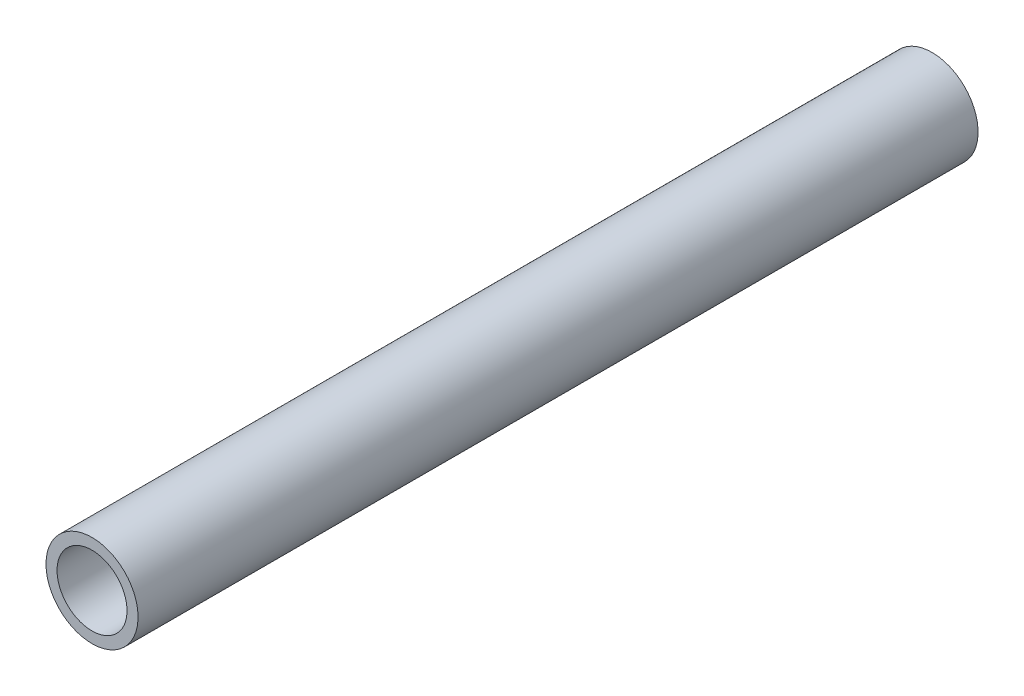
ISO-10303-21;
HEADER;
FILE_DESCRIPTION(('STEP AP214'),'2;1');
FILE_NAME('part.step','',(''),(''),'','','');
FILE_SCHEMA(('AUTOMOTIVE_DESIGN { 1 0 10303 214 1 1 1 1 }'));
ENDSEC;
DATA;
#1=APPLICATION_CONTEXT('core data for automotive mechanical design processes');
#2=APPLICATION_PROTOCOL_DEFINITION('international standard','automotive_design',2000,#1);
#3=PRODUCT_CONTEXT('',#1,'mechanical');
#4=PRODUCT('Part','Part','',(#3));
#5=PRODUCT_RELATED_PRODUCT_CATEGORY('part','',(#4));
#6=PRODUCT_DEFINITION_FORMATION('','',#4);
#7=PRODUCT_DEFINITION_CONTEXT('part definition',#1,'design');
#8=PRODUCT_DEFINITION('design','',#6,#7);
#9=PRODUCT_DEFINITION_SHAPE('','',#8);
#10=(LENGTH_UNIT() NAMED_UNIT(*) SI_UNIT(.MILLI.,.METRE.));
#11=(NAMED_UNIT(*) PLANE_ANGLE_UNIT() SI_UNIT($,.RADIAN.));
#12=(NAMED_UNIT(*) SI_UNIT($,.STERADIAN.) SOLID_ANGLE_UNIT());
#13=UNCERTAINTY_MEASURE_WITH_UNIT(LENGTH_MEASURE(1.E-05),#10,'distance_accuracy_value','');
#14=(GEOMETRIC_REPRESENTATION_CONTEXT(3) GLOBAL_UNCERTAINTY_ASSIGNED_CONTEXT((#13)) GLOBAL_UNIT_ASSIGNED_CONTEXT((#10,
#11,#12)) REPRESENTATION_CONTEXT('',''));
#15=CARTESIAN_POINT('',(0.,0.,0.));
#16=DIRECTION('',(0.,0.,1.));
#17=DIRECTION('',(1.,0.,0.));
#18=AXIS2_PLACEMENT_3D('',#15,#16,#17);
#19=CARTESIAN_POINT('',(0.,0.,304.8));
#20=DIRECTION('',(0.,0.,1.));
#21=DIRECTION('',(1.,0.,0.));
#22=AXIS2_PLACEMENT_3D('',#19,#20,#21);
#23=PLANE('',#22);
#24=CARTESIAN_POINT('',(0.,0.,304.8));
#25=DIRECTION('',(0.,0.,1.));
#26=DIRECTION('',(1.,0.,0.));
#27=AXIS2_PLACEMENT_3D('',#24,#25,#26);
#28=CIRCLE('',#27,16.7005);
#29=CARTESIAN_POINT('',(-16.7005,0.,304.8));
#30=VERTEX_POINT('',#29);
#31=EDGE_CURVE('E10',#30,#30,#28,.T.);
#32=ORIENTED_EDGE('',*,*,#31,.T.);
#33=EDGE_LOOP('',(#32));
#34=FACE_BOUND('',#33,.T.);
#35=CARTESIAN_POINT('',(0.,0.,304.8));
#36=DIRECTION('',(0.,0.,1.));
#37=DIRECTION('',(1.,0.,0.));
#38=AXIS2_PLACEMENT_3D('',#35,#36,#37);
#39=CIRCLE('',#38,12.7);
#40=CARTESIAN_POINT('',(-12.7,0.,304.8));
#41=VERTEX_POINT('',#40);
#42=EDGE_CURVE('E44',#41,#41,#39,.T.);
#43=ORIENTED_EDGE('',*,*,#42,.F.);
#44=EDGE_LOOP('',(#43));
#45=FACE_BOUND('',#44,.T.);
#46=ADVANCED_FACE('F33',(#34,#45),#23,.T.);
#47=CARTESIAN_POINT('',(0.,0.,0.));
#48=DIRECTION('',(0.,0.,1.));
#49=DIRECTION('',(1.,0.,0.));
#50=AXIS2_PLACEMENT_3D('',#47,#48,#49);
#51=PLANE('',#50);
#52=CARTESIAN_POINT('',(0.,0.,0.));
#53=DIRECTION('',(0.,0.,1.));
#54=DIRECTION('',(1.,0.,0.));
#55=AXIS2_PLACEMENT_3D('',#52,#53,#54);
#56=CIRCLE('',#55,16.7005);
#57=CARTESIAN_POINT('',(-16.7005,0.,0.));
#58=VERTEX_POINT('',#57);
#59=EDGE_CURVE('E37',#58,#58,#56,.T.);
#60=ORIENTED_EDGE('',*,*,#59,.F.);
#61=EDGE_LOOP('',(#60));
#62=FACE_BOUND('',#61,.T.);
#63=CARTESIAN_POINT('',(0.,0.,0.));
#64=DIRECTION('',(0.,0.,1.));
#65=DIRECTION('',(1.,0.,0.));
#66=AXIS2_PLACEMENT_3D('',#63,#64,#65);
#67=CIRCLE('',#66,12.7);
#68=CARTESIAN_POINT('',(-12.7,0.,0.));
#69=VERTEX_POINT('',#68);
#70=EDGE_CURVE('E46',#69,#69,#67,.T.);
#71=ORIENTED_EDGE('',*,*,#70,.T.);
#72=EDGE_LOOP('',(#71));
#73=FACE_BOUND('',#72,.T.);
#74=ADVANCED_FACE('F56',(#62,#73),#51,.F.);
#75=CARTESIAN_POINT('',(0.,0.,304.8));
#76=DIRECTION('',(0.,0.,-1.));
#77=DIRECTION('',(-1.,0.,0.));
#78=AXIS2_PLACEMENT_3D('',#75,#76,#77);
#79=CYLINDRICAL_SURFACE('',#78,16.7005);
#80=CARTESIAN_POINT('',(-16.7005,0.,304.8));
#81=CARTESIAN_POINT('',(-16.7005,0.,301.625));
#82=CARTESIAN_POINT('',(-16.7005,0.,298.45));
#83=CARTESIAN_POINT('',(-16.7005,0.,292.1));
#84=CARTESIAN_POINT('',(-16.7005,0.,288.925));
#85=CARTESIAN_POINT('',(-16.7005,0.,282.575));
#86=CARTESIAN_POINT('',(-16.7005,0.,279.4));
#87=CARTESIAN_POINT('',(-16.7005,0.,273.05));
#88=CARTESIAN_POINT('',(-16.7005,0.,269.875));
#89=CARTESIAN_POINT('',(-16.7005,0.,263.525));
#90=CARTESIAN_POINT('',(-16.7005,0.,260.35));
#91=CARTESIAN_POINT('',(-16.7005,0.,254.));
#92=CARTESIAN_POINT('',(-16.7005,0.,250.825));
#93=CARTESIAN_POINT('',(-16.7005,0.,244.475));
#94=CARTESIAN_POINT('',(-16.7005,0.,241.3));
#95=CARTESIAN_POINT('',(-16.7005,0.,234.95));
#96=CARTESIAN_POINT('',(-16.7005,0.,231.775));
#97=CARTESIAN_POINT('',(-16.7005,0.,225.425));
#98=CARTESIAN_POINT('',(-16.7005,0.,222.25));
#99=CARTESIAN_POINT('',(-16.7005,0.,215.9));
#100=CARTESIAN_POINT('',(-16.7005,0.,212.725));
#101=CARTESIAN_POINT('',(-16.7005,0.,206.375));
#102=CARTESIAN_POINT('',(-16.7005,0.,203.2));
#103=CARTESIAN_POINT('',(-16.7005,0.,196.85));
#104=CARTESIAN_POINT('',(-16.7005,0.,193.675));
#105=CARTESIAN_POINT('',(-16.7005,0.,187.325));
#106=CARTESIAN_POINT('',(-16.7005,0.,184.15));
#107=CARTESIAN_POINT('',(-16.7005,0.,177.8));
#108=CARTESIAN_POINT('',(-16.7005,0.,174.625));
#109=CARTESIAN_POINT('',(-16.7005,0.,168.275));
#110=CARTESIAN_POINT('',(-16.7005,0.,165.1));
#111=CARTESIAN_POINT('',(-16.7005,0.,158.75));
#112=CARTESIAN_POINT('',(-16.7005,0.,155.575));
#113=CARTESIAN_POINT('',(-16.7005,0.,149.225));
#114=CARTESIAN_POINT('',(-16.7005,0.,146.05));
#115=CARTESIAN_POINT('',(-16.7005,0.,139.7));
#116=CARTESIAN_POINT('',(-16.7005,0.,136.525));
#117=CARTESIAN_POINT('',(-16.7005,0.,130.175));
#118=CARTESIAN_POINT('',(-16.7005,0.,127.));
#119=CARTESIAN_POINT('',(-16.7005,0.,120.65));
#120=CARTESIAN_POINT('',(-16.7005,0.,117.475));
#121=CARTESIAN_POINT('',(-16.7005,0.,111.125));
#122=CARTESIAN_POINT('',(-16.7005,0.,107.95));
#123=CARTESIAN_POINT('',(-16.7005,0.,101.6));
#124=CARTESIAN_POINT('',(-16.7005,0.,98.425));
#125=CARTESIAN_POINT('',(-16.7005,0.,92.075));
#126=CARTESIAN_POINT('',(-16.7005,0.,88.9));
#127=CARTESIAN_POINT('',(-16.7005,0.,82.55));
#128=CARTESIAN_POINT('',(-16.7005,0.,79.375));
#129=CARTESIAN_POINT('',(-16.7005,0.,73.025));
#130=CARTESIAN_POINT('',(-16.7005,0.,69.85));
#131=CARTESIAN_POINT('',(-16.7005,0.,63.5));
#132=CARTESIAN_POINT('',(-16.7005,0.,60.325));
#133=CARTESIAN_POINT('',(-16.7005,0.,53.975));
#134=CARTESIAN_POINT('',(-16.7005,0.,50.8));
#135=CARTESIAN_POINT('',(-16.7005,0.,44.45));
#136=CARTESIAN_POINT('',(-16.7005,0.,41.275));
#137=CARTESIAN_POINT('',(-16.7005,0.,34.925));
#138=CARTESIAN_POINT('',(-16.7005,0.,31.75));
#139=CARTESIAN_POINT('',(-16.7005,0.,25.4));
#140=CARTESIAN_POINT('',(-16.7005,0.,22.225));
#141=CARTESIAN_POINT('',(-16.7005,0.,15.875));
#142=CARTESIAN_POINT('',(-16.7005,0.,12.7));
#143=CARTESIAN_POINT('',(-16.7005,0.,6.35));
#144=CARTESIAN_POINT('',(-16.7005,0.,3.175));
#145=CARTESIAN_POINT('',(-16.7005,0.,0.));
#146=B_SPLINE_CURVE_WITH_KNOTS('',3,(#80,#81,#82,#83,#84,#85,#86,#87,#88,#89,#90,#91,#92,#93,
#94,#95,#96,#97,#98,#99,#100,#101,#102,#103,#104,#105,#106,#107,#108,#109,#110,#111,#112,#113,
#114,#115,#116,#117,#118,#119,#120,#121,#122,#123,#124,#125,#126,#127,#128,#129,#130,#131,#132,
#133,#134,#135,#136,#137,#138,#139,#140,#141,#142,#143,#144,#145),.UNSPECIFIED.,.F.,.F.,(4,2,2,
2,2,2,2,2,2,2,2,2,2,2,2,2,2,2,2,2,2,2,2,2,2,2,2,2,2,2,2,2,4),(0.,9.52500000000001,19.05,28.575,
38.1,47.625,57.15,66.675,76.2,85.7250000000001,95.2500000000001,104.775,114.3,123.825,133.35,
142.875,152.4,161.925,171.45,180.975,190.5,200.025,209.55,219.075,228.6,238.125,247.65,257.175,
266.7,276.225,285.75,295.275,304.8),.UNSPECIFIED.);
#147=EDGE_CURVE('BSEAM35',#30,#58,#146,.T.);
#148=ORIENTED_EDGE('',*,*,#31,.F.);
#149=ORIENTED_EDGE('',*,*,#59,.T.);
#150=ORIENTED_EDGE('',*,*,#147,.T.);
#151=ORIENTED_EDGE('',*,*,#147,.F.);
#152=EDGE_LOOP('',(#148,#150,#149,#151));
#153=FACE_BOUND('',#152,.T.);
#154=ADVANCED_FACE('F35',(#153),#79,.T.);
#155=CARTESIAN_POINT('',(0.,0.,304.8));
#156=DIRECTION('',(0.,0.,-1.));
#157=DIRECTION('',(-1.,0.,0.));
#158=AXIS2_PLACEMENT_3D('',#155,#156,#157);
#159=CYLINDRICAL_SURFACE('',#158,12.7);
#160=CARTESIAN_POINT('',(-12.7,0.,304.8));
#161=CARTESIAN_POINT('',(-12.7,0.,301.625));
#162=CARTESIAN_POINT('',(-12.7,0.,298.45));
#163=CARTESIAN_POINT('',(-12.7,0.,292.1));
#164=CARTESIAN_POINT('',(-12.7,0.,288.925));
#165=CARTESIAN_POINT('',(-12.7,0.,282.575));
#166=CARTESIAN_POINT('',(-12.7,0.,279.4));
#167=CARTESIAN_POINT('',(-12.7,0.,273.05));
#168=CARTESIAN_POINT('',(-12.7,0.,269.875));
#169=CARTESIAN_POINT('',(-12.7,0.,263.525));
#170=CARTESIAN_POINT('',(-12.7,0.,260.35));
#171=CARTESIAN_POINT('',(-12.7,0.,254.));
#172=CARTESIAN_POINT('',(-12.7,0.,250.825));
#173=CARTESIAN_POINT('',(-12.7,0.,244.475));
#174=CARTESIAN_POINT('',(-12.7,0.,241.3));
#175=CARTESIAN_POINT('',(-12.7,0.,234.95));
#176=CARTESIAN_POINT('',(-12.7,0.,231.775));
#177=CARTESIAN_POINT('',(-12.7,0.,225.425));
#178=CARTESIAN_POINT('',(-12.7,0.,222.25));
#179=CARTESIAN_POINT('',(-12.7,0.,215.9));
#180=CARTESIAN_POINT('',(-12.7,0.,212.725));
#181=CARTESIAN_POINT('',(-12.7,0.,206.375));
#182=CARTESIAN_POINT('',(-12.7,0.,203.2));
#183=CARTESIAN_POINT('',(-12.7,0.,196.85));
#184=CARTESIAN_POINT('',(-12.7,0.,193.675));
#185=CARTESIAN_POINT('',(-12.7,0.,187.325));
#186=CARTESIAN_POINT('',(-12.7,0.,184.15));
#187=CARTESIAN_POINT('',(-12.7,0.,177.8));
#188=CARTESIAN_POINT('',(-12.7,0.,174.625));
#189=CARTESIAN_POINT('',(-12.7,0.,168.275));
#190=CARTESIAN_POINT('',(-12.7,0.,165.1));
#191=CARTESIAN_POINT('',(-12.7,0.,158.75));
#192=CARTESIAN_POINT('',(-12.7,0.,155.575));
#193=CARTESIAN_POINT('',(-12.7,0.,149.225));
#194=CARTESIAN_POINT('',(-12.7,0.,146.05));
#195=CARTESIAN_POINT('',(-12.7,0.,139.7));
#196=CARTESIAN_POINT('',(-12.7,0.,136.525));
#197=CARTESIAN_POINT('',(-12.7,0.,130.175));
#198=CARTESIAN_POINT('',(-12.7,0.,127.));
#199=CARTESIAN_POINT('',(-12.7,0.,120.65));
#200=CARTESIAN_POINT('',(-12.7,0.,117.475));
#201=CARTESIAN_POINT('',(-12.7,0.,111.125));
#202=CARTESIAN_POINT('',(-12.7,0.,107.95));
#203=CARTESIAN_POINT('',(-12.7,0.,101.6));
#204=CARTESIAN_POINT('',(-12.7,0.,98.425));
#205=CARTESIAN_POINT('',(-12.7,0.,92.075));
#206=CARTESIAN_POINT('',(-12.7,0.,88.9));
#207=CARTESIAN_POINT('',(-12.7,0.,82.55));
#208=CARTESIAN_POINT('',(-12.7,0.,79.375));
#209=CARTESIAN_POINT('',(-12.7,0.,73.025));
#210=CARTESIAN_POINT('',(-12.7,0.,69.85));
#211=CARTESIAN_POINT('',(-12.7,0.,63.5));
#212=CARTESIAN_POINT('',(-12.7,0.,60.325));
#213=CARTESIAN_POINT('',(-12.7,0.,53.975));
#214=CARTESIAN_POINT('',(-12.7,0.,50.8));
#215=CARTESIAN_POINT('',(-12.7,0.,44.45));
#216=CARTESIAN_POINT('',(-12.7,0.,41.275));
#217=CARTESIAN_POINT('',(-12.7,0.,34.925));
#218=CARTESIAN_POINT('',(-12.7,0.,31.75));
#219=CARTESIAN_POINT('',(-12.7,0.,25.4));
#220=CARTESIAN_POINT('',(-12.7,0.,22.225));
#221=CARTESIAN_POINT('',(-12.7,0.,15.875));
#222=CARTESIAN_POINT('',(-12.7,0.,12.7));
#223=CARTESIAN_POINT('',(-12.7,0.,6.35));
#224=CARTESIAN_POINT('',(-12.7,0.,3.175));
#225=CARTESIAN_POINT('',(-12.7,0.,0.));
#226=B_SPLINE_CURVE_WITH_KNOTS('',3,(#160,#161,#162,#163,#164,#165,#166,#167,#168,#169,#170,
#171,#172,#173,#174,#175,#176,#177,#178,#179,#180,#181,#182,#183,#184,#185,#186,#187,#188,#189,
#190,#191,#192,#193,#194,#195,#196,#197,#198,#199,#200,#201,#202,#203,#204,#205,#206,#207,#208,
#209,#210,#211,#212,#213,#214,#215,#216,#217,#218,#219,#220,#221,#222,#223,#224,#225),
.UNSPECIFIED.,.F.,.F.,(4,2,2,2,2,2,2,2,2,2,2,2,2,2,2,2,2,2,2,2,2,2,2,2,2,2,2,2,2,2,2,2,4),(0.,
9.52500000000001,19.05,28.575,38.1,47.625,57.15,66.675,76.2,85.7250000000001,95.2500000000001,
104.775,114.3,123.825,133.35,142.875,152.4,161.925,171.45,180.975,190.5,200.025,209.55,219.075,
228.6,238.125,247.65,257.175,266.7,276.225,285.75,295.275,304.8),.UNSPECIFIED.);
#227=EDGE_CURVE('BSEAM52',#41,#69,#226,.T.);
#228=ORIENTED_EDGE('',*,*,#42,.T.);
#229=ORIENTED_EDGE('',*,*,#70,.F.);
#230=ORIENTED_EDGE('',*,*,#227,.T.);
#231=ORIENTED_EDGE('',*,*,#227,.F.);
#232=EDGE_LOOP('',(#228,#230,#229,#231));
#233=FACE_BOUND('',#232,.T.);
#234=ADVANCED_FACE('F52',(#233),#159,.F.);
#235=CLOSED_SHELL('',(#46,#74,#154,#234));
#236=MANIFOLD_SOLID_BREP('B2',#235);
#237=ADVANCED_BREP_SHAPE_REPRESENTATION('',(#18,#236),#14);
#238=SHAPE_DEFINITION_REPRESENTATION(#9,#237);
ENDSEC;
END-ISO-10303-21;
